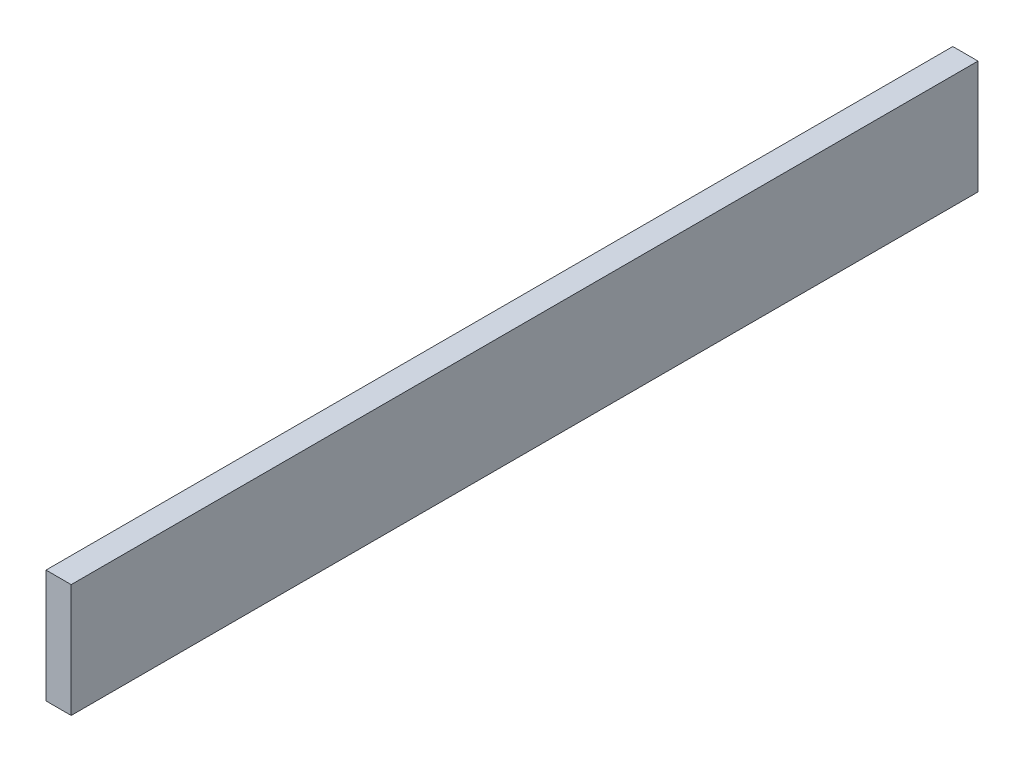
ISO-10303-21;
HEADER;
FILE_DESCRIPTION(('STEP AP214'),'2;1');
FILE_NAME('part.step','',(''),(''),'','','');
FILE_SCHEMA(('AUTOMOTIVE_DESIGN { 1 0 10303 214 1 1 1 1 }'));
ENDSEC;
DATA;
#1=APPLICATION_CONTEXT('core data for automotive mechanical design processes');
#2=APPLICATION_PROTOCOL_DEFINITION('international standard','automotive_design',2000,#1);
#3=PRODUCT_CONTEXT('',#1,'mechanical');
#4=PRODUCT('Part','Part','',(#3));
#5=PRODUCT_RELATED_PRODUCT_CATEGORY('part','',(#4));
#6=PRODUCT_DEFINITION_FORMATION('','',#4);
#7=PRODUCT_DEFINITION_CONTEXT('part definition',#1,'design');
#8=PRODUCT_DEFINITION('design','',#6,#7);
#9=PRODUCT_DEFINITION_SHAPE('','',#8);
#10=(LENGTH_UNIT() NAMED_UNIT(*) SI_UNIT(.MILLI.,.METRE.));
#11=(NAMED_UNIT(*) PLANE_ANGLE_UNIT() SI_UNIT($,.RADIAN.));
#12=(NAMED_UNIT(*) SI_UNIT($,.STERADIAN.) SOLID_ANGLE_UNIT());
#13=UNCERTAINTY_MEASURE_WITH_UNIT(LENGTH_MEASURE(1.E-05),#10,'distance_accuracy_value','');
#14=(GEOMETRIC_REPRESENTATION_CONTEXT(3) GLOBAL_UNCERTAINTY_ASSIGNED_CONTEXT((#13)) GLOBAL_UNIT_ASSIGNED_CONTEXT((#10,
#11,#12)) REPRESENTATION_CONTEXT('',''));
#15=CARTESIAN_POINT('',(0.,0.,0.));
#16=DIRECTION('',(0.,0.,1.));
#17=DIRECTION('',(1.,0.,0.));
#18=AXIS2_PLACEMENT_3D('',#15,#16,#17);
#19=CARTESIAN_POINT('',(20.,28.7695494129221,0.));
#20=DIRECTION('',(0.,-1.,0.));
#21=DIRECTION('',(0.,0.,-1.));
#22=AXIS2_PLACEMENT_3D('',#19,#20,#21);
#23=PLANE('',#22);
#24=DIRECTION('',(0.,0.,1.));
#25=VECTOR('',#24,1.);
#26=CARTESIAN_POINT('',(0.,28.7695494129221,0.));
#27=LINE('',#26,#25);
#28=CARTESIAN_POINT('',(0.,28.7695494129222,-592.107417893648));
#29=VERTEX_POINT('',#28);
#30=CARTESIAN_POINT('',(0.,28.7695494129221,127.892582106352));
#31=VERTEX_POINT('',#30);
#32=EDGE_CURVE('E97',#29,#31,#27,.T.);
#33=ORIENTED_EDGE('',*,*,#32,.T.);
#34=DIRECTION('',(-1.,0.,0.));
#35=VECTOR('',#34,1.);
#36=CARTESIAN_POINT('',(20.,28.7695494129221,127.892582106352));
#37=LINE('',#36,#35);
#38=CARTESIAN_POINT('',(20.,28.7695494129221,127.892582106352));
#39=VERTEX_POINT('',#38);
#40=EDGE_CURVE('E11',#39,#31,#37,.T.);
#41=ORIENTED_EDGE('',*,*,#40,.F.);
#42=DIRECTION('',(0.,0.,1.));
#43=VECTOR('',#42,1.);
#44=CARTESIAN_POINT('',(20.,28.7695494129221,0.));
#45=LINE('',#44,#43);
#46=CARTESIAN_POINT('',(20.,28.7695494129222,-592.107417893648));
#47=VERTEX_POINT('',#46);
#48=EDGE_CURVE('E83',#47,#39,#45,.T.);
#49=ORIENTED_EDGE('',*,*,#48,.F.);
#50=DIRECTION('',(-1.,0.,0.));
#51=VECTOR('',#50,1.);
#52=CARTESIAN_POINT('',(20.,28.7695494129222,-592.107417893648));
#53=LINE('',#52,#51);
#54=EDGE_CURVE('E50',#47,#29,#53,.T.);
#55=ORIENTED_EDGE('',*,*,#54,.T.);
#56=EDGE_LOOP('',(#33,#41,#49,#55));
#57=FACE_BOUND('',#56,.T.);
#58=ADVANCED_FACE('F34',(#57),#23,.F.);
#59=CARTESIAN_POINT('',(20.,0.,127.892582106352));
#60=DIRECTION('',(0.,0.,-1.));
#61=DIRECTION('',(-1.,0.,0.));
#62=AXIS2_PLACEMENT_3D('',#59,#60,#61);
#63=PLANE('',#62);
#64=DIRECTION('',(0.,-1.,0.));
#65=VECTOR('',#64,1.);
#66=CARTESIAN_POINT('',(0.,0.,127.892582106352));
#67=LINE('',#66,#65);
#68=CARTESIAN_POINT('',(0.,-61.2304505870779,127.892582106352));
#69=VERTEX_POINT('',#68);
#70=EDGE_CURVE('E88',#31,#69,#67,.T.);
#71=ORIENTED_EDGE('',*,*,#70,.T.);
#72=DIRECTION('',(-1.,0.,0.));
#73=VECTOR('',#72,1.);
#74=CARTESIAN_POINT('',(20.,-61.2304505870779,127.892582106352));
#75=LINE('',#74,#73);
#76=CARTESIAN_POINT('',(20.,-61.2304505870779,127.892582106352));
#77=VERTEX_POINT('',#76);
#78=EDGE_CURVE('E42',#77,#69,#75,.T.);
#79=ORIENTED_EDGE('',*,*,#78,.F.);
#80=DIRECTION('',(0.,-1.,0.));
#81=VECTOR('',#80,1.);
#82=CARTESIAN_POINT('',(20.,0.,127.892582106352));
#83=LINE('',#82,#81);
#84=EDGE_CURVE('E75',#39,#77,#83,.T.);
#85=ORIENTED_EDGE('',*,*,#84,.F.);
#86=ORIENTED_EDGE('',*,*,#40,.T.);
#87=EDGE_LOOP('',(#71,#79,#85,#86));
#88=FACE_BOUND('',#87,.T.);
#89=ADVANCED_FACE('F87',(#88),#63,.F.);
#90=CARTESIAN_POINT('',(20.,-61.2304505870779,0.));
#91=DIRECTION('',(0.,-1.,0.));
#92=DIRECTION('',(0.,0.,-1.));
#93=AXIS2_PLACEMENT_3D('',#90,#91,#92);
#94=PLANE('',#93);
#95=DIRECTION('',(0.,0.,1.));
#96=VECTOR('',#95,1.);
#97=CARTESIAN_POINT('',(0.,-61.2304505870779,0.));
#98=LINE('',#97,#96);
#99=CARTESIAN_POINT('',(0.,-61.2304505870778,-592.107417893648));
#100=VERTEX_POINT('',#99);
#101=EDGE_CURVE('E100',#100,#69,#98,.T.);
#102=ORIENTED_EDGE('',*,*,#101,.F.);
#103=DIRECTION('',(-1.,0.,0.));
#104=VECTOR('',#103,1.);
#105=CARTESIAN_POINT('',(20.,-61.2304505870778,-592.107417893648));
#106=LINE('',#105,#104);
#107=CARTESIAN_POINT('',(20.,-61.2304505870778,-592.107417893648));
#108=VERTEX_POINT('',#107);
#109=EDGE_CURVE('E64',#108,#100,#106,.T.);
#110=ORIENTED_EDGE('',*,*,#109,.F.);
#111=DIRECTION('',(0.,0.,1.));
#112=VECTOR('',#111,1.);
#113=CARTESIAN_POINT('',(20.,-61.2304505870779,0.));
#114=LINE('',#113,#112);
#115=EDGE_CURVE('E82',#108,#77,#114,.T.);
#116=ORIENTED_EDGE('',*,*,#115,.T.);
#117=ORIENTED_EDGE('',*,*,#78,.T.);
#118=EDGE_LOOP('',(#102,#110,#116,#117));
#119=FACE_BOUND('',#118,.T.);
#120=ADVANCED_FACE('F91',(#119),#94,.T.);
#121=CARTESIAN_POINT('',(20.,0.,-592.107417893648));
#122=DIRECTION('',(0.,0.,-1.));
#123=DIRECTION('',(-1.,0.,0.));
#124=AXIS2_PLACEMENT_3D('',#121,#122,#123);
#125=PLANE('',#124);
#126=DIRECTION('',(0.,-1.,0.));
#127=VECTOR('',#126,1.);
#128=CARTESIAN_POINT('',(0.,0.,-592.107417893648));
#129=LINE('',#128,#127);
#130=EDGE_CURVE('E102',#29,#100,#129,.T.);
#131=ORIENTED_EDGE('',*,*,#130,.F.);
#132=ORIENTED_EDGE('',*,*,#54,.F.);
#133=DIRECTION('',(0.,-1.,0.));
#134=VECTOR('',#133,1.);
#135=CARTESIAN_POINT('',(20.,0.,-592.107417893648));
#136=LINE('',#135,#134);
#137=EDGE_CURVE('E92',#47,#108,#136,.T.);
#138=ORIENTED_EDGE('',*,*,#137,.T.);
#139=ORIENTED_EDGE('',*,*,#109,.T.);
#140=EDGE_LOOP('',(#131,#132,#138,#139));
#141=FACE_BOUND('',#140,.T.);
#142=ADVANCED_FACE('F108',(#141),#125,.T.);
#143=CARTESIAN_POINT('',(20.,0.,0.));
#144=DIRECTION('',(1.,0.,0.));
#145=DIRECTION('',(0.,0.,-1.));
#146=AXIS2_PLACEMENT_3D('',#143,#144,#145);
#147=PLANE('',#146);
#148=ORIENTED_EDGE('',*,*,#48,.T.);
#149=ORIENTED_EDGE('',*,*,#84,.T.);
#150=ORIENTED_EDGE('',*,*,#115,.F.);
#151=ORIENTED_EDGE('',*,*,#137,.F.);
#152=EDGE_LOOP('',(#148,#149,#150,#151));
#153=FACE_BOUND('',#152,.T.);
#154=ADVANCED_FACE('F79',(#153),#147,.T.);
#155=CARTESIAN_POINT('',(0.,0.,0.));
#156=DIRECTION('',(1.,0.,0.));
#157=DIRECTION('',(0.,0.,-1.));
#158=AXIS2_PLACEMENT_3D('',#155,#156,#157);
#159=PLANE('',#158);
#160=ORIENTED_EDGE('',*,*,#32,.F.);
#161=ORIENTED_EDGE('',*,*,#130,.T.);
#162=ORIENTED_EDGE('',*,*,#101,.T.);
#163=ORIENTED_EDGE('',*,*,#70,.F.);
#164=EDGE_LOOP('',(#160,#161,#162,#163));
#165=FACE_BOUND('',#164,.T.);
#166=ADVANCED_FACE('F107',(#165),#159,.F.);
#167=CLOSED_SHELL('',(#58,#89,#120,#142,#154,#166));
#168=MANIFOLD_SOLID_BREP('B2',#167);
#169=ADVANCED_BREP_SHAPE_REPRESENTATION('',(#18,#168),#14);
#170=SHAPE_DEFINITION_REPRESENTATION(#9,#169);
ENDSEC;
END-ISO-10303-21;
